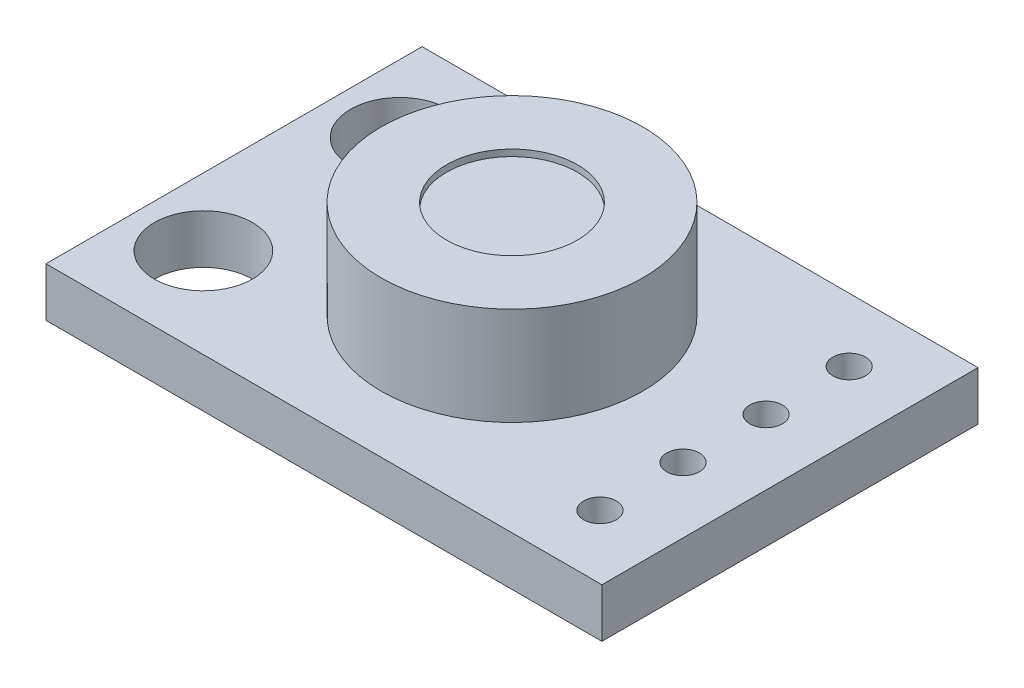
ISO-10303-21;
HEADER;
FILE_DESCRIPTION(('STEP AP214'),'2;1');
FILE_NAME('part.step','',(''),(''),'','','');
FILE_SCHEMA(('AUTOMOTIVE_DESIGN { 1 0 10303 214 1 1 1 1 }'));
ENDSEC;
DATA;
#1=APPLICATION_CONTEXT('core data for automotive mechanical design processes');
#2=APPLICATION_PROTOCOL_DEFINITION('international standard','automotive_design',2000,#1);
#3=PRODUCT_CONTEXT('',#1,'mechanical');
#4=PRODUCT('Part','Part','',(#3));
#5=PRODUCT_RELATED_PRODUCT_CATEGORY('part','',(#4));
#6=PRODUCT_DEFINITION_FORMATION('','',#4);
#7=PRODUCT_DEFINITION_CONTEXT('part definition',#1,'design');
#8=PRODUCT_DEFINITION('design','',#6,#7);
#9=PRODUCT_DEFINITION_SHAPE('','',#8);
#10=(LENGTH_UNIT() NAMED_UNIT(*) SI_UNIT(.MILLI.,.METRE.));
#11=(NAMED_UNIT(*) PLANE_ANGLE_UNIT() SI_UNIT($,.RADIAN.));
#12=(NAMED_UNIT(*) SI_UNIT($,.STERADIAN.) SOLID_ANGLE_UNIT());
#13=UNCERTAINTY_MEASURE_WITH_UNIT(LENGTH_MEASURE(1.E-05),#10,'distance_accuracy_value','');
#14=(GEOMETRIC_REPRESENTATION_CONTEXT(3) GLOBAL_UNCERTAINTY_ASSIGNED_CONTEXT((#13)) GLOBAL_UNIT_ASSIGNED_CONTEXT((#10,
#11,#12)) REPRESENTATION_CONTEXT('',''));
#15=CARTESIAN_POINT('',(0.,0.,0.));
#16=DIRECTION('',(0.,0.,1.));
#17=DIRECTION('',(1.,0.,0.));
#18=AXIS2_PLACEMENT_3D('',#15,#16,#17);
#19=CARTESIAN_POINT('',(0.,1.5,0.));
#20=DIRECTION('',(0.,1.,0.));
#21=DIRECTION('',(0.,0.,1.));
#22=AXIS2_PLACEMENT_3D('',#19,#20,#21);
#23=PLANE('',#22);
#24=CARTESIAN_POINT('',(-6.43732088993986,1.5,3.));
#25=DIRECTION('',(0.,1.,0.));
#26=DIRECTION('',(0.,0.,1.));
#27=AXIS2_PLACEMENT_3D('',#24,#25,#26);
#28=CIRCLE('',#27,1.5);
#29=CARTESIAN_POINT('',(-6.43732088993986,1.5,4.5));
#30=VERTEX_POINT('',#29);
#31=EDGE_CURVE('E157',#30,#30,#28,.T.);
#32=ORIENTED_EDGE('',*,*,#31,.F.);
#33=EDGE_LOOP('',(#32));
#34=FACE_BOUND('',#33,.T.);
#35=CARTESIAN_POINT('',(-6.43732088993986,1.5,-3.));
#36=DIRECTION('',(0.,1.,0.));
#37=DIRECTION('',(0.,0.,1.));
#38=AXIS2_PLACEMENT_3D('',#35,#36,#37);
#39=CIRCLE('',#38,1.5);
#40=CARTESIAN_POINT('',(-6.43732088993986,1.5,-1.5));
#41=VERTEX_POINT('',#40);
#42=EDGE_CURVE('E151',#41,#41,#39,.T.);
#43=ORIENTED_EDGE('',*,*,#42,.F.);
#44=EDGE_LOOP('',(#43));
#45=FACE_BOUND('',#44,.T.);
#46=CARTESIAN_POINT('',(6.50000000000001,1.5,3.81));
#47=DIRECTION('',(0.,1.,0.));
#48=DIRECTION('',(0.,0.,1.));
#49=AXIS2_PLACEMENT_3D('',#46,#47,#48);
#50=CIRCLE('',#49,0.5);
#51=CARTESIAN_POINT('',(6.50000000000001,1.5,4.31));
#52=VERTEX_POINT('',#51);
#53=EDGE_CURVE('E145',#52,#52,#50,.T.);
#54=ORIENTED_EDGE('',*,*,#53,.F.);
#55=EDGE_LOOP('',(#54));
#56=FACE_BOUND('',#55,.T.);
#57=CARTESIAN_POINT('',(6.50000000000001,1.5,1.27));
#58=DIRECTION('',(0.,1.,0.));
#59=DIRECTION('',(0.,0.,1.));
#60=AXIS2_PLACEMENT_3D('',#57,#58,#59);
#61=CIRCLE('',#60,0.5);
#62=CARTESIAN_POINT('',(6.50000000000001,1.5,1.77));
#63=VERTEX_POINT('',#62);
#64=EDGE_CURVE('E139',#63,#63,#61,.T.);
#65=ORIENTED_EDGE('',*,*,#64,.F.);
#66=EDGE_LOOP('',(#65));
#67=FACE_BOUND('',#66,.T.);
#68=CARTESIAN_POINT('',(6.50000000000001,1.5,-1.27));
#69=DIRECTION('',(0.,1.,0.));
#70=DIRECTION('',(0.,0.,1.));
#71=AXIS2_PLACEMENT_3D('',#68,#69,#70);
#72=CIRCLE('',#71,0.5);
#73=CARTESIAN_POINT('',(6.50000000000001,1.5,-0.77));
#74=VERTEX_POINT('',#73);
#75=EDGE_CURVE('E133',#74,#74,#72,.T.);
#76=ORIENTED_EDGE('',*,*,#75,.F.);
#77=EDGE_LOOP('',(#76));
#78=FACE_BOUND('',#77,.T.);
#79=CARTESIAN_POINT('',(6.50000000000001,1.5,-3.81));
#80=DIRECTION('',(0.,1.,0.));
#81=DIRECTION('',(0.,0.,1.));
#82=AXIS2_PLACEMENT_3D('',#79,#80,#81);
#83=CIRCLE('',#82,0.5);
#84=CARTESIAN_POINT('',(6.50000000000001,1.5,-3.31));
#85=VERTEX_POINT('',#84);
#86=EDGE_CURVE('E127',#85,#85,#83,.T.);
#87=ORIENTED_EDGE('',*,*,#86,.F.);
#88=EDGE_LOOP('',(#87));
#89=FACE_BOUND('',#88,.T.);
#90=DIRECTION('',(0.,0.,-1.));
#91=VECTOR('',#90,1.);
#92=CARTESIAN_POINT('',(8.5,1.5,-5.75));
#93=LINE('',#92,#91);
#94=CARTESIAN_POINT('',(8.50000000000001,1.5,5.75));
#95=VERTEX_POINT('',#94);
#96=CARTESIAN_POINT('',(8.5,1.5,-5.75));
#97=VERTEX_POINT('',#96);
#98=EDGE_CURVE('E89',#95,#97,#93,.T.);
#99=ORIENTED_EDGE('',*,*,#98,.T.);
#100=DIRECTION('',(-1.,0.,0.));
#101=VECTOR('',#100,1.);
#102=CARTESIAN_POINT('',(-8.5,1.5,-5.75));
#103=LINE('',#102,#101);
#104=CARTESIAN_POINT('',(-8.5,1.5,-5.75));
#105=VERTEX_POINT('',#104);
#106=EDGE_CURVE('E84',#97,#105,#103,.T.);
#107=ORIENTED_EDGE('',*,*,#106,.T.);
#108=DIRECTION('',(0.,0.,1.));
#109=VECTOR('',#108,1.);
#110=CARTESIAN_POINT('',(-8.5,1.5,-5.75));
#111=LINE('',#110,#109);
#112=CARTESIAN_POINT('',(-8.49999999999999,1.5,5.75));
#113=VERTEX_POINT('',#112);
#114=EDGE_CURVE('E87',#105,#113,#111,.T.);
#115=ORIENTED_EDGE('',*,*,#114,.T.);
#116=DIRECTION('',(1.,0.,0.));
#117=VECTOR('',#116,1.);
#118=CARTESIAN_POINT('',(-8.49999999999999,1.5,5.75));
#119=LINE('',#118,#117);
#120=EDGE_CURVE('E54',#113,#95,#119,.T.);
#121=ORIENTED_EDGE('',*,*,#120,.T.);
#122=EDGE_LOOP('',(#99,#107,#115,#121));
#123=FACE_BOUND('',#122,.T.);
#124=CARTESIAN_POINT('',(0.,1.5,0.));
#125=DIRECTION('',(0.,1.,0.));
#126=DIRECTION('',(0.,0.,1.));
#127=AXIS2_PLACEMENT_3D('',#124,#125,#126);
#128=CIRCLE('',#127,4.);
#129=CARTESIAN_POINT('',(0.,1.5,4.));
#130=VERTEX_POINT('',#129);
#131=EDGE_CURVE('E115',#130,#130,#128,.T.);
#132=ORIENTED_EDGE('',*,*,#131,.F.);
#133=EDGE_LOOP('',(#132));
#134=FACE_BOUND('',#133,.T.);
#135=ADVANCED_FACE('F37',(#34,#45,#56,#67,#78,#89,#123,#134),#23,.T.);
#136=CARTESIAN_POINT('',(8.5,1.5,-5.75));
#137=DIRECTION('',(-1.,0.,0.));
#138=DIRECTION('',(0.,0.,1.));
#139=AXIS2_PLACEMENT_3D('',#136,#137,#138);
#140=PLANE('',#139);
#141=DIRECTION('',(0.,0.,-1.));
#142=VECTOR('',#141,1.);
#143=CARTESIAN_POINT('',(8.5,0.,-5.75));
#144=LINE('',#143,#142);
#145=CARTESIAN_POINT('',(8.50000000000001,0.,5.75));
#146=VERTEX_POINT('',#145);
#147=CARTESIAN_POINT('',(8.5,0.,-5.75));
#148=VERTEX_POINT('',#147);
#149=EDGE_CURVE('E101',#146,#148,#144,.T.);
#150=ORIENTED_EDGE('',*,*,#149,.T.);
#151=DIRECTION('',(0.,-1.,0.));
#152=VECTOR('',#151,1.);
#153=CARTESIAN_POINT('',(8.5,1.5,-5.75));
#154=LINE('',#153,#152);
#155=EDGE_CURVE('E11',#97,#148,#154,.T.);
#156=ORIENTED_EDGE('',*,*,#155,.F.);
#157=ORIENTED_EDGE('',*,*,#98,.F.);
#158=DIRECTION('',(0.,-1.,0.));
#159=VECTOR('',#158,1.);
#160=CARTESIAN_POINT('',(8.50000000000001,1.5,5.75));
#161=LINE('',#160,#159);
#162=EDGE_CURVE('E97',#95,#146,#161,.T.);
#163=ORIENTED_EDGE('',*,*,#162,.T.);
#164=EDGE_LOOP('',(#150,#156,#157,#163));
#165=FACE_BOUND('',#164,.T.);
#166=ADVANCED_FACE('F39',(#165),#140,.F.);
#167=CARTESIAN_POINT('',(-8.5,1.5,-5.75));
#168=DIRECTION('',(0.,0.,1.));
#169=DIRECTION('',(1.,0.,0.));
#170=AXIS2_PLACEMENT_3D('',#167,#168,#169);
#171=PLANE('',#170);
#172=DIRECTION('',(-1.,0.,0.));
#173=VECTOR('',#172,1.);
#174=CARTESIAN_POINT('',(-8.5,0.,-5.75));
#175=LINE('',#174,#173);
#176=CARTESIAN_POINT('',(-8.5,0.,-5.75));
#177=VERTEX_POINT('',#176);
#178=EDGE_CURVE('E93',#148,#177,#175,.T.);
#179=ORIENTED_EDGE('',*,*,#178,.T.);
#180=DIRECTION('',(0.,-1.,0.));
#181=VECTOR('',#180,1.);
#182=CARTESIAN_POINT('',(-8.5,1.5,-5.75));
#183=LINE('',#182,#181);
#184=EDGE_CURVE('E46',#105,#177,#183,.T.);
#185=ORIENTED_EDGE('',*,*,#184,.F.);
#186=ORIENTED_EDGE('',*,*,#106,.F.);
#187=ORIENTED_EDGE('',*,*,#155,.T.);
#188=EDGE_LOOP('',(#179,#185,#186,#187));
#189=FACE_BOUND('',#188,.T.);
#190=ADVANCED_FACE('F92',(#189),#171,.F.);
#191=CARTESIAN_POINT('',(-8.5,1.5,-5.75));
#192=DIRECTION('',(1.,0.,0.));
#193=DIRECTION('',(0.,0.,-1.));
#194=AXIS2_PLACEMENT_3D('',#191,#192,#193);
#195=PLANE('',#194);
#196=DIRECTION('',(0.,0.,1.));
#197=VECTOR('',#196,1.);
#198=CARTESIAN_POINT('',(-8.5,0.,-5.75));
#199=LINE('',#198,#197);
#200=CARTESIAN_POINT('',(-8.49999999999999,0.,5.75));
#201=VERTEX_POINT('',#200);
#202=EDGE_CURVE('E71',#177,#201,#199,.T.);
#203=ORIENTED_EDGE('',*,*,#202,.T.);
#204=DIRECTION('',(0.,-1.,0.));
#205=VECTOR('',#204,1.);
#206=CARTESIAN_POINT('',(-8.49999999999999,1.5,5.75));
#207=LINE('',#206,#205);
#208=EDGE_CURVE('E94',#113,#201,#207,.T.);
#209=ORIENTED_EDGE('',*,*,#208,.F.);
#210=ORIENTED_EDGE('',*,*,#114,.F.);
#211=ORIENTED_EDGE('',*,*,#184,.T.);
#212=EDGE_LOOP('',(#203,#209,#210,#211));
#213=FACE_BOUND('',#212,.T.);
#214=ADVANCED_FACE('F95',(#213),#195,.F.);
#215=CARTESIAN_POINT('',(-8.49999999999999,1.5,5.75));
#216=DIRECTION('',(0.,0.,-1.));
#217=DIRECTION('',(-1.,0.,0.));
#218=AXIS2_PLACEMENT_3D('',#215,#216,#217);
#219=PLANE('',#218);
#220=DIRECTION('',(1.,0.,0.));
#221=VECTOR('',#220,1.);
#222=CARTESIAN_POINT('',(-8.49999999999999,0.,5.75));
#223=LINE('',#222,#221);
#224=EDGE_CURVE('E77',#201,#146,#223,.T.);
#225=ORIENTED_EDGE('',*,*,#224,.T.);
#226=ORIENTED_EDGE('',*,*,#162,.F.);
#227=ORIENTED_EDGE('',*,*,#120,.F.);
#228=ORIENTED_EDGE('',*,*,#208,.T.);
#229=EDGE_LOOP('',(#225,#226,#227,#228));
#230=FACE_BOUND('',#229,.T.);
#231=ADVANCED_FACE('F109',(#230),#219,.F.);
#232=CARTESIAN_POINT('',(0.,0.,0.));
#233=DIRECTION('',(0.,1.,0.));
#234=DIRECTION('',(0.,0.,1.));
#235=AXIS2_PLACEMENT_3D('',#232,#233,#234);
#236=PLANE('',#235);
#237=CARTESIAN_POINT('',(-6.43732088993986,0.,3.));
#238=DIRECTION('',(0.,1.,0.));
#239=DIRECTION('',(0.,0.,1.));
#240=AXIS2_PLACEMENT_3D('',#237,#238,#239);
#241=CIRCLE('',#240,1.5);
#242=CARTESIAN_POINT('',(-6.43732088993986,0.,4.5));
#243=VERTEX_POINT('',#242);
#244=EDGE_CURVE('E154',#243,#243,#241,.T.);
#245=ORIENTED_EDGE('',*,*,#244,.T.);
#246=EDGE_LOOP('',(#245));
#247=FACE_BOUND('',#246,.T.);
#248=CARTESIAN_POINT('',(-6.43732088993986,0.,-3.));
#249=DIRECTION('',(0.,1.,0.));
#250=DIRECTION('',(0.,0.,1.));
#251=AXIS2_PLACEMENT_3D('',#248,#249,#250);
#252=CIRCLE('',#251,1.5);
#253=CARTESIAN_POINT('',(-6.43732088993986,0.,-1.5));
#254=VERTEX_POINT('',#253);
#255=EDGE_CURVE('E148',#254,#254,#252,.T.);
#256=ORIENTED_EDGE('',*,*,#255,.T.);
#257=EDGE_LOOP('',(#256));
#258=FACE_BOUND('',#257,.T.);
#259=CARTESIAN_POINT('',(6.50000000000001,0.,3.81));
#260=DIRECTION('',(0.,1.,0.));
#261=DIRECTION('',(0.,0.,1.));
#262=AXIS2_PLACEMENT_3D('',#259,#260,#261);
#263=CIRCLE('',#262,0.5);
#264=CARTESIAN_POINT('',(6.50000000000001,0.,4.31));
#265=VERTEX_POINT('',#264);
#266=EDGE_CURVE('E142',#265,#265,#263,.T.);
#267=ORIENTED_EDGE('',*,*,#266,.T.);
#268=EDGE_LOOP('',(#267));
#269=FACE_BOUND('',#268,.T.);
#270=CARTESIAN_POINT('',(6.50000000000001,0.,1.27));
#271=DIRECTION('',(0.,1.,0.));
#272=DIRECTION('',(0.,0.,1.));
#273=AXIS2_PLACEMENT_3D('',#270,#271,#272);
#274=CIRCLE('',#273,0.5);
#275=CARTESIAN_POINT('',(6.50000000000001,0.,1.77));
#276=VERTEX_POINT('',#275);
#277=EDGE_CURVE('E136',#276,#276,#274,.T.);
#278=ORIENTED_EDGE('',*,*,#277,.T.);
#279=EDGE_LOOP('',(#278));
#280=FACE_BOUND('',#279,.T.);
#281=CARTESIAN_POINT('',(6.50000000000001,0.,-1.27));
#282=DIRECTION('',(0.,1.,0.));
#283=DIRECTION('',(0.,0.,1.));
#284=AXIS2_PLACEMENT_3D('',#281,#282,#283);
#285=CIRCLE('',#284,0.5);
#286=CARTESIAN_POINT('',(6.50000000000001,0.,-0.77));
#287=VERTEX_POINT('',#286);
#288=EDGE_CURVE('E130',#287,#287,#285,.T.);
#289=ORIENTED_EDGE('',*,*,#288,.T.);
#290=EDGE_LOOP('',(#289));
#291=FACE_BOUND('',#290,.T.);
#292=CARTESIAN_POINT('',(6.50000000000001,0.,-3.81));
#293=DIRECTION('',(0.,1.,0.));
#294=DIRECTION('',(0.,0.,1.));
#295=AXIS2_PLACEMENT_3D('',#292,#293,#294);
#296=CIRCLE('',#295,0.5);
#297=CARTESIAN_POINT('',(6.50000000000001,0.,-3.31));
#298=VERTEX_POINT('',#297);
#299=EDGE_CURVE('E124',#298,#298,#296,.T.);
#300=ORIENTED_EDGE('',*,*,#299,.T.);
#301=EDGE_LOOP('',(#300));
#302=FACE_BOUND('',#301,.T.);
#303=ORIENTED_EDGE('',*,*,#149,.F.);
#304=ORIENTED_EDGE('',*,*,#224,.F.);
#305=ORIENTED_EDGE('',*,*,#202,.F.);
#306=ORIENTED_EDGE('',*,*,#178,.F.);
#307=EDGE_LOOP('',(#303,#304,#305,#306));
#308=FACE_BOUND('',#307,.T.);
#309=ADVANCED_FACE('F112',(#247,#258,#269,#280,#291,#302,#308),#236,.F.);
#310=CARTESIAN_POINT('',(0.,4.5,0.));
#311=DIRECTION('',(0.,-1.,0.));
#312=DIRECTION('',(0.,0.,-1.));
#313=AXIS2_PLACEMENT_3D('',#310,#311,#312);
#314=CYLINDRICAL_SURFACE('',#313,4.);
#315=CARTESIAN_POINT('',(0.,4.5,0.));
#316=DIRECTION('',(0.,1.,0.));
#317=DIRECTION('',(0.,0.,1.));
#318=AXIS2_PLACEMENT_3D('',#315,#316,#317);
#319=CIRCLE('',#318,4.);
#320=CARTESIAN_POINT('',(0.,4.5,4.));
#321=VERTEX_POINT('',#320);
#322=EDGE_CURVE('E104',#321,#321,#319,.T.);
#323=ORIENTED_EDGE('',*,*,#322,.F.);
#324=EDGE_LOOP('',(#323));
#325=FACE_BOUND('',#324,.T.);
#326=ORIENTED_EDGE('',*,*,#131,.T.);
#327=EDGE_LOOP('',(#326));
#328=FACE_BOUND('',#327,.T.);
#329=ADVANCED_FACE('F210',(#325,#328),#314,.T.);
#330=CARTESIAN_POINT('',(0.,4.5,0.));
#331=DIRECTION('',(0.,1.,0.));
#332=DIRECTION('',(0.,0.,1.));
#333=AXIS2_PLACEMENT_3D('',#330,#331,#332);
#334=PLANE('',#333);
#335=CARTESIAN_POINT('',(0.,4.5,0.));
#336=DIRECTION('',(0.,1.,0.));
#337=DIRECTION('',(0.,0.,1.));
#338=AXIS2_PLACEMENT_3D('',#335,#336,#337);
#339=CIRCLE('',#338,2.);
#340=CARTESIAN_POINT('',(0.,4.5,2.));
#341=VERTEX_POINT('',#340);
#342=EDGE_CURVE('E121',#341,#341,#339,.T.);
#343=ORIENTED_EDGE('',*,*,#342,.F.);
#344=EDGE_LOOP('',(#343));
#345=FACE_BOUND('',#344,.T.);
#346=ORIENTED_EDGE('',*,*,#322,.T.);
#347=EDGE_LOOP('',(#346));
#348=FACE_BOUND('',#347,.T.);
#349=ADVANCED_FACE('F206',(#345,#348),#334,.T.);
#350=CARTESIAN_POINT('',(0.,4.3,0.));
#351=DIRECTION('',(0.,1.,0.));
#352=DIRECTION('',(0.,0.,1.));
#353=AXIS2_PLACEMENT_3D('',#350,#351,#352);
#354=CYLINDRICAL_SURFACE('',#353,2.);
#355=CARTESIAN_POINT('',(0.,4.3,0.));
#356=DIRECTION('',(0.,1.,0.));
#357=DIRECTION('',(0.,0.,1.));
#358=AXIS2_PLACEMENT_3D('',#355,#356,#357);
#359=CIRCLE('',#358,2.);
#360=CARTESIAN_POINT('',(0.,4.3,2.));
#361=VERTEX_POINT('',#360);
#362=EDGE_CURVE('E118',#361,#361,#359,.T.);
#363=ORIENTED_EDGE('',*,*,#362,.F.);
#364=EDGE_LOOP('',(#363));
#365=FACE_BOUND('',#364,.T.);
#366=ORIENTED_EDGE('',*,*,#342,.T.);
#367=EDGE_LOOP('',(#366));
#368=FACE_BOUND('',#367,.T.);
#369=ADVANCED_FACE('F198',(#365,#368),#354,.F.);
#370=CARTESIAN_POINT('',(0.,4.3,0.));
#371=DIRECTION('',(0.,1.,0.));
#372=DIRECTION('',(0.,0.,1.));
#373=AXIS2_PLACEMENT_3D('',#370,#371,#372);
#374=PLANE('',#373);
#375=ORIENTED_EDGE('',*,*,#362,.T.);
#376=EDGE_LOOP('',(#375));
#377=FACE_BOUND('',#376,.T.);
#378=ADVANCED_FACE('F188',(#377),#374,.T.);
#379=CARTESIAN_POINT('',(6.50000000000001,0.,-3.81));
#380=DIRECTION('',(0.,1.,0.));
#381=DIRECTION('',(0.,0.,1.));
#382=AXIS2_PLACEMENT_3D('',#379,#380,#381);
#383=CYLINDRICAL_SURFACE('',#382,0.5);
#384=ORIENTED_EDGE('',*,*,#299,.F.);
#385=EDGE_LOOP('',(#384));
#386=FACE_BOUND('',#385,.T.);
#387=ORIENTED_EDGE('',*,*,#86,.T.);
#388=EDGE_LOOP('',(#387));
#389=FACE_BOUND('',#388,.T.);
#390=ADVANCED_FACE('F185',(#386,#389),#383,.F.);
#391=CARTESIAN_POINT('',(6.50000000000001,0.,-1.27));
#392=DIRECTION('',(0.,1.,0.));
#393=DIRECTION('',(0.,0.,1.));
#394=AXIS2_PLACEMENT_3D('',#391,#392,#393);
#395=CYLINDRICAL_SURFACE('',#394,0.5);
#396=ORIENTED_EDGE('',*,*,#288,.F.);
#397=EDGE_LOOP('',(#396));
#398=FACE_BOUND('',#397,.T.);
#399=ORIENTED_EDGE('',*,*,#75,.T.);
#400=EDGE_LOOP('',(#399));
#401=FACE_BOUND('',#400,.T.);
#402=ADVANCED_FACE('F187',(#398,#401),#395,.F.);
#403=CARTESIAN_POINT('',(6.50000000000001,0.,1.27));
#404=DIRECTION('',(0.,1.,0.));
#405=DIRECTION('',(0.,0.,1.));
#406=AXIS2_PLACEMENT_3D('',#403,#404,#405);
#407=CYLINDRICAL_SURFACE('',#406,0.5);
#408=ORIENTED_EDGE('',*,*,#277,.F.);
#409=EDGE_LOOP('',(#408));
#410=FACE_BOUND('',#409,.T.);
#411=ORIENTED_EDGE('',*,*,#64,.T.);
#412=EDGE_LOOP('',(#411));
#413=FACE_BOUND('',#412,.T.);
#414=ADVANCED_FACE('F195',(#410,#413),#407,.F.);
#415=CARTESIAN_POINT('',(6.50000000000001,0.,3.81));
#416=DIRECTION('',(0.,1.,0.));
#417=DIRECTION('',(0.,0.,1.));
#418=AXIS2_PLACEMENT_3D('',#415,#416,#417);
#419=CYLINDRICAL_SURFACE('',#418,0.5);
#420=ORIENTED_EDGE('',*,*,#266,.F.);
#421=EDGE_LOOP('',(#420));
#422=FACE_BOUND('',#421,.T.);
#423=ORIENTED_EDGE('',*,*,#53,.T.);
#424=EDGE_LOOP('',(#423));
#425=FACE_BOUND('',#424,.T.);
#426=ADVANCED_FACE('F262',(#422,#425),#419,.F.);
#427=CARTESIAN_POINT('',(-6.43732088993986,0.,-3.));
#428=DIRECTION('',(0.,1.,0.));
#429=DIRECTION('',(0.,0.,1.));
#430=AXIS2_PLACEMENT_3D('',#427,#428,#429);
#431=CYLINDRICAL_SURFACE('',#430,1.5);
#432=ORIENTED_EDGE('',*,*,#255,.F.);
#433=EDGE_LOOP('',(#432));
#434=FACE_BOUND('',#433,.T.);
#435=ORIENTED_EDGE('',*,*,#42,.T.);
#436=EDGE_LOOP('',(#435));
#437=FACE_BOUND('',#436,.T.);
#438=ADVANCED_FACE('F168',(#434,#437),#431,.F.);
#439=CARTESIAN_POINT('',(-6.43732088993986,0.,3.));
#440=DIRECTION('',(0.,1.,0.));
#441=DIRECTION('',(0.,0.,1.));
#442=AXIS2_PLACEMENT_3D('',#439,#440,#441);
#443=CYLINDRICAL_SURFACE('',#442,1.5);
#444=ORIENTED_EDGE('',*,*,#244,.F.);
#445=EDGE_LOOP('',(#444));
#446=FACE_BOUND('',#445,.T.);
#447=ORIENTED_EDGE('',*,*,#31,.T.);
#448=EDGE_LOOP('',(#447));
#449=FACE_BOUND('',#448,.T.);
#450=ADVANCED_FACE('F165',(#446,#449),#443,.F.);
#451=CLOSED_SHELL('',(#135,#166,#190,#214,#231,#309,#329,#349,#369,#378,#390,#402,#414,#426,
#438,#450));
#452=MANIFOLD_SOLID_BREP('B2',#451);
#453=ADVANCED_BREP_SHAPE_REPRESENTATION('',(#18,#452),#14);
#454=SHAPE_DEFINITION_REPRESENTATION(#9,#453);
ENDSEC;
END-ISO-10303-21;
